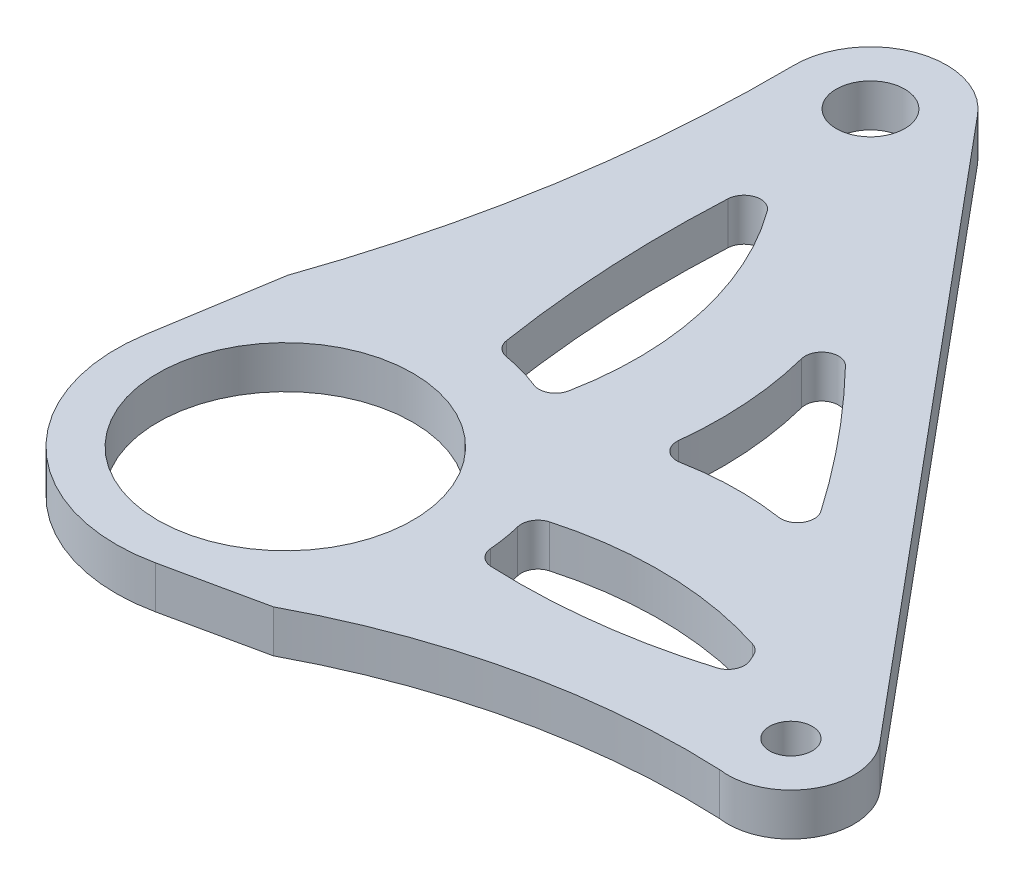
ISO-10303-21;
HEADER;
FILE_DESCRIPTION(('STEP AP214'),'2;1');
FILE_NAME('part.step','',(''),(''),'','','');
FILE_SCHEMA(('AUTOMOTIVE_DESIGN { 1 0 10303 214 1 1 1 1 }'));
ENDSEC;
DATA;
#1=APPLICATION_CONTEXT('core data for automotive mechanical design processes');
#2=APPLICATION_PROTOCOL_DEFINITION('international standard','automotive_design',2000,#1);
#3=PRODUCT_CONTEXT('',#1,'mechanical');
#4=PRODUCT('Part','Part','',(#3));
#5=PRODUCT_RELATED_PRODUCT_CATEGORY('part','',(#4));
#6=PRODUCT_DEFINITION_FORMATION('','',#4);
#7=PRODUCT_DEFINITION_CONTEXT('part definition',#1,'design');
#8=PRODUCT_DEFINITION('design','',#6,#7);
#9=PRODUCT_DEFINITION_SHAPE('','',#8);
#10=(LENGTH_UNIT() NAMED_UNIT(*) SI_UNIT(.MILLI.,.METRE.));
#11=(NAMED_UNIT(*) PLANE_ANGLE_UNIT() SI_UNIT($,.RADIAN.));
#12=(NAMED_UNIT(*) SI_UNIT($,.STERADIAN.) SOLID_ANGLE_UNIT());
#13=UNCERTAINTY_MEASURE_WITH_UNIT(LENGTH_MEASURE(1.E-05),#10,'distance_accuracy_value','');
#14=(GEOMETRIC_REPRESENTATION_CONTEXT(3) GLOBAL_UNCERTAINTY_ASSIGNED_CONTEXT((#13)) GLOBAL_UNIT_ASSIGNED_CONTEXT((#10,
#11,#12)) REPRESENTATION_CONTEXT('',''));
#15=CARTESIAN_POINT('',(0.,0.,0.));
#16=DIRECTION('',(0.,0.,1.));
#17=DIRECTION('',(1.,0.,0.));
#18=AXIS2_PLACEMENT_3D('',#15,#16,#17);
#19=CARTESIAN_POINT('',(-19.9914586600345,5.08,-3.22553571428571));
#20=DIRECTION('',(0.987232526421455,0.,0.159285714285714));
#21=DIRECTION('',(0.159285714285714,0.,-0.987232526421456));
#22=AXIS2_PLACEMENT_3D('',#19,#20,#21);
#23=PLANE('',#22);
#24=DIRECTION('',(0.,1.,0.));
#25=VECTOR('',#24,1.);
#26=CARTESIAN_POINT('',(-17.6262506561667,0.,-17.8847930346395));
#27=LINE('',#26,#25);
#28=CARTESIAN_POINT('',(-17.6262506561667,0.,-17.8847930346395));
#29=VERTEX_POINT('',#28);
#30=CARTESIAN_POINT('',(-17.6262506561667,5.08,-17.8847930346395));
#31=VERTEX_POINT('',#30);
#32=EDGE_CURVE('E246',#29,#31,#27,.T.);
#33=ORIENTED_EDGE('',*,*,#32,.F.);
#34=DIRECTION('',(-0.159285714285714,0.,0.987232526421456));
#35=VECTOR('',#34,1.);
#36=CARTESIAN_POINT('',(-19.9914586600345,0.,-3.22553571428571));
#37=LINE('',#36,#35);
#38=CARTESIAN_POINT('',(-19.9914586600345,0.,-3.22553571428571));
#39=VERTEX_POINT('',#38);
#40=EDGE_CURVE('E251',#29,#39,#37,.T.);
#41=ORIENTED_EDGE('',*,*,#40,.T.);
#42=DIRECTION('',(0.,-1.,0.));
#43=VECTOR('',#42,1.);
#44=CARTESIAN_POINT('',(-19.9914586600345,5.08,-3.22553571428571));
#45=LINE('',#44,#43);
#46=CARTESIAN_POINT('',(-19.9914586600345,5.08,-3.22553571428571));
#47=VERTEX_POINT('',#46);
#48=EDGE_CURVE('E373',#47,#39,#45,.T.);
#49=ORIENTED_EDGE('',*,*,#48,.F.);
#50=DIRECTION('',(-0.159285714285714,0.,0.987232526421456));
#51=VECTOR('',#50,1.);
#52=CARTESIAN_POINT('',(-19.9914586600345,5.08,-3.22553571428571));
#53=LINE('',#52,#51);
#54=EDGE_CURVE('E326',#31,#47,#53,.T.);
#55=ORIENTED_EDGE('',*,*,#54,.F.);
#56=EDGE_LOOP('',(#33,#41,#49,#55));
#57=FACE_BOUND('',#56,.T.);
#58=ADVANCED_FACE('F41',(#57),#23,.F.);
#59=CARTESIAN_POINT('',(4.25223214285715,5.08,19.798510595579));
#60=DIRECTION('',(-0.209986772486773,0.,-0.977704226942171));
#61=DIRECTION('',(-0.977704226942171,0.,0.209986772486773));
#62=AXIS2_PLACEMENT_3D('',#59,#60,#61);
#63=PLANE('',#62);
#64=DIRECTION('',(0.,1.,0.));
#65=VECTOR('',#64,1.);
#66=CARTESIAN_POINT('',(15.8719645912288,0.,17.3028784332586));
#67=LINE('',#66,#65);
#68=CARTESIAN_POINT('',(15.8719645912288,0.,17.3028784332586));
#69=VERTEX_POINT('',#68);
#70=CARTESIAN_POINT('',(15.8719645912288,5.08,17.3028784332586));
#71=VERTEX_POINT('',#70);
#72=EDGE_CURVE('E318',#69,#71,#67,.T.);
#73=ORIENTED_EDGE('',*,*,#72,.T.);
#74=DIRECTION('',(0.977704226942171,0.,-0.209986772486773));
#75=VECTOR('',#74,1.);
#76=CARTESIAN_POINT('',(4.25223214285715,5.08,19.798510595579));
#77=LINE('',#76,#75);
#78=CARTESIAN_POINT('',(4.25223214285714,5.08,19.798510595579));
#79=VERTEX_POINT('',#78);
#80=EDGE_CURVE('E331',#79,#71,#77,.T.);
#81=ORIENTED_EDGE('',*,*,#80,.F.);
#82=DIRECTION('',(0.,-1.,0.));
#83=VECTOR('',#82,1.);
#84=CARTESIAN_POINT('',(4.25223214285714,5.08,19.798510595579));
#85=LINE('',#84,#83);
#86=CARTESIAN_POINT('',(4.25223214285714,0.,19.798510595579));
#87=VERTEX_POINT('',#86);
#88=EDGE_CURVE('E370',#79,#87,#85,.T.);
#89=ORIENTED_EDGE('',*,*,#88,.T.);
#90=DIRECTION('',(0.977704226942171,0.,-0.209986772486773));
#91=VECTOR('',#90,1.);
#92=CARTESIAN_POINT('',(4.25223214285715,0.,19.798510595579));
#93=LINE('',#92,#91);
#94=EDGE_CURVE('E353',#87,#69,#93,.T.);
#95=ORIENTED_EDGE('',*,*,#94,.T.);
#96=EDGE_LOOP('',(#73,#81,#89,#95));
#97=FACE_BOUND('',#96,.T.);
#98=ADVANCED_FACE('F496',(#97),#63,.F.);
#99=CARTESIAN_POINT('',(0.,5.08,0.));
#100=DIRECTION('',(0.,1.,0.));
#101=DIRECTION('',(0.,0.,1.));
#102=AXIS2_PLACEMENT_3D('',#99,#100,#101);
#103=PLANE('',#102);
#104=CARTESIAN_POINT('',(-21.3828159281263,5.08,-28.968811621449));
#105=DIRECTION('',(0.,1.,0.));
#106=DIRECTION('',(0.,0.,1.));
#107=AXIS2_PLACEMENT_3D('',#104,#105,#106);
#108=CIRCLE('',#107,44.5258754149349);
#109=CARTESIAN_POINT('',(21.7591015367583,5.08,-39.9837350855225));
#110=VERTEX_POINT('',#109);
#111=CARTESIAN_POINT('',(22.8837242987162,5.08,-24.1701662072058));
#112=VERTEX_POINT('',#111);
#113=EDGE_CURVE('E282',#110,#112,#108,.F.);
#114=ORIENTED_EDGE('',*,*,#113,.F.);
#115=CARTESIAN_POINT('',(23.6969373260761,5.08,-40.4785001344485));
#116=DIRECTION('',(0.,1.,0.));
#117=DIRECTION('',(0.,0.,1.));
#118=AXIS2_PLACEMENT_3D('',#115,#116,#117);
#119=CIRCLE('',#118,2.);
#120=CARTESIAN_POINT('',(25.1313285261964,5.08,-41.8722439721094));
#121=VERTEX_POINT('',#120);
#122=EDGE_CURVE('E445',#110,#121,#119,.F.);
#123=ORIENTED_EDGE('',*,*,#122,.T.);
#124=CARTESIAN_POINT('',(-67.7138191361468,5.08,48.3418847817815));
#125=DIRECTION('',(0.,1.,0.));
#126=DIRECTION('',(0.,0.,1.));
#127=AXIS2_PLACEMENT_3D('',#124,#125,#126);
#128=CIRCLE('',#127,129.455824400704);
#129=CARTESIAN_POINT('',(38.7419162597416,5.08,-25.3194135544989));
#130=VERTEX_POINT('',#129);
#131=EDGE_CURVE('E277',#121,#130,#128,.F.);
#132=ORIENTED_EDGE('',*,*,#131,.T.);
#133=CARTESIAN_POINT('',(37.0972512029362,5.08,-24.1813991209686));
#134=DIRECTION('',(0.,1.,0.));
#135=DIRECTION('',(0.,0.,1.));
#136=AXIS2_PLACEMENT_3D('',#133,#134,#135);
#137=CIRCLE('',#136,2.);
#138=CARTESIAN_POINT('',(36.7994765641196,5.08,-22.203690784414));
#139=VERTEX_POINT('',#138);
#140=EDGE_CURVE('E441',#130,#139,#137,.F.);
#141=ORIENTED_EDGE('',*,*,#140,.T.);
#142=CARTESIAN_POINT('',(31.6532704941625,5.08,11.9754948125493));
#143=DIRECTION('',(0.,1.,0.));
#144=DIRECTION('',(0.,0.,1.));
#145=AXIS2_PLACEMENT_3D('',#142,#143,#144);
#146=CIRCLE('',#145,34.5644349727595);
#147=CARTESIAN_POINT('',(25.2429930871164,5.08,-21.9893179876244));
#148=VERTEX_POINT('',#147);
#149=EDGE_CURVE('E285',#148,#139,#146,.F.);
#150=ORIENTED_EDGE('',*,*,#149,.F.);
#151=CARTESIAN_POINT('',(24.8720755580379,5.08,-23.9546220828275));
#152=DIRECTION('',(0.,1.,0.));
#153=DIRECTION('',(0.,0.,1.));
#154=AXIS2_PLACEMENT_3D('',#151,#152,#153);
#155=CIRCLE('',#154,2.);
#156=EDGE_CURVE('E449',#148,#112,#155,.F.);
#157=ORIENTED_EDGE('',*,*,#156,.T.);
#158=EDGE_LOOP('',(#114,#123,#132,#141,#150,#157));
#159=FACE_BOUND('',#158,.T.);
#160=CARTESIAN_POINT('',(0.,5.08,-70.));
#161=DIRECTION('',(0.,1.,0.));
#162=DIRECTION('',(0.,0.,1.));
#163=AXIS2_PLACEMENT_3D('',#160,#161,#162);
#164=CIRCLE('',#163,4.10000000000001);
#165=CARTESIAN_POINT('',(0.,5.08,-65.9));
#166=VERTEX_POINT('',#165);
#167=EDGE_CURVE('E341',#166,#166,#164,.T.);
#168=ORIENTED_EDGE('',*,*,#167,.F.);
#169=EDGE_LOOP('',(#168));
#170=FACE_BOUND('',#169,.T.);
#171=CARTESIAN_POINT('',(60.48,5.08,0.));
#172=DIRECTION('',(0.,1.,0.));
#173=DIRECTION('',(0.,0.,1.));
#174=AXIS2_PLACEMENT_3D('',#171,#172,#173);
#175=CIRCLE('',#174,2.54999999999999);
#176=CARTESIAN_POINT('',(60.48,5.08,2.54999999999999));
#177=VERTEX_POINT('',#176);
#178=EDGE_CURVE('E344',#177,#177,#175,.T.);
#179=ORIENTED_EDGE('',*,*,#178,.F.);
#180=EDGE_LOOP('',(#179));
#181=FACE_BOUND('',#180,.T.);
#182=CARTESIAN_POINT('',(0.,5.08,0.));
#183=DIRECTION('',(0.,1.,0.));
#184=DIRECTION('',(0.,0.,1.));
#185=AXIS2_PLACEMENT_3D('',#182,#183,#184);
#186=CIRCLE('',#185,15.25);
#187=CARTESIAN_POINT('',(0.,5.08,15.25));
#188=VERTEX_POINT('',#187);
#189=EDGE_CURVE('E347',#188,#188,#186,.T.);
#190=ORIENTED_EDGE('',*,*,#189,.F.);
#191=EDGE_LOOP('',(#190));
#192=FACE_BOUND('',#191,.T.);
#193=CARTESIAN_POINT('',(27.9061018564134,5.08,-71.8453844913845));
#194=DIRECTION('',(0.,1.,0.));
#195=DIRECTION('',(0.,0.,1.));
#196=AXIS2_PLACEMENT_3D('',#193,#194,#195);
#197=CIRCLE('',#196,72.0203148013481);
#198=CARTESIAN_POINT('',(24.7291495693579,5.08,0.104825503104408));
#199=VERTEX_POINT('',#198);
#200=CARTESIAN_POINT('',(48.7082419065126,5.08,-2.89470129374433));
#201=VERTEX_POINT('',#200);
#202=EDGE_CURVE('E310',#199,#201,#197,.T.);
#203=ORIENTED_EDGE('',*,*,#202,.F.);
#204=CARTESIAN_POINT('',(24.8173733516565,5.08,-1.89322769044099));
#205=DIRECTION('',(0.,1.,0.));
#206=DIRECTION('',(0.,0.,1.));
#207=AXIS2_PLACEMENT_3D('',#204,#205,#206);
#208=CIRCLE('',#207,2.);
#209=CARTESIAN_POINT('',(22.8231676857903,5.08,-1.74109694986847));
#210=VERTEX_POINT('',#209);
#211=EDGE_CURVE('E425',#199,#210,#208,.F.);
#212=ORIENTED_EDGE('',*,*,#211,.T.);
#213=CARTESIAN_POINT('',(0.,5.08,0.));
#214=DIRECTION('',(0.,1.,0.));
#215=DIRECTION('',(0.,0.,1.));
#216=AXIS2_PLACEMENT_3D('',#213,#214,#215);
#217=CIRCLE('',#216,22.8894823402047);
#218=CARTESIAN_POINT('',(22.1930546313307,5.08,-5.6032783201724));
#219=VERTEX_POINT('',#218);
#220=EDGE_CURVE('E306',#210,#219,#217,.T.);
#221=ORIENTED_EDGE('',*,*,#220,.T.);
#222=CARTESIAN_POINT('',(24.132203302452,5.08,-6.09287246973781));
#223=DIRECTION('',(0.,1.,0.));
#224=DIRECTION('',(0.,0.,1.));
#225=AXIS2_PLACEMENT_3D('',#222,#223,#224);
#226=CIRCLE('',#225,2.);
#227=CARTESIAN_POINT('',(23.5944845426233,5.08,-8.01923134993856));
#228=VERTEX_POINT('',#227);
#229=EDGE_CURVE('E429',#219,#228,#226,.F.);
#230=ORIENTED_EDGE('',*,*,#229,.T.);
#231=CARTESIAN_POINT('',(35.1366815769163,5.08,33.3302907703614));
#232=DIRECTION('',(0.,1.,0.));
#233=DIRECTION('',(0.,0.,1.));
#234=AXIS2_PLACEMENT_3D('',#231,#232,#233);
#235=CIRCLE('',#234,42.9302375017378);
#236=CARTESIAN_POINT('',(48.3797465181453,5.08,-7.50629237414287));
#237=VERTEX_POINT('',#236);
#238=EDGE_CURVE('E303',#228,#237,#235,.F.);
#239=ORIENTED_EDGE('',*,*,#238,.T.);
#240=CARTESIAN_POINT('',(47.7627890675515,5.08,-5.60382988984606));
#241=DIRECTION('',(0.,1.,0.));
#242=DIRECTION('',(0.,0.,1.));
#243=AXIS2_PLACEMENT_3D('',#240,#241,#242);
#244=CIRCLE('',#243,2.);
#245=CARTESIAN_POINT('',(49.5748146653878,5.08,-6.4503304703457));
#246=VERTEX_POINT('',#245);
#247=EDGE_CURVE('E433',#237,#246,#244,.F.);
#248=ORIENTED_EDGE('',*,*,#247,.T.);
#249=CARTESIAN_POINT('',(-67.7138191361468,5.08,48.3418847817815));
#250=DIRECTION('',(0.,1.,0.));
#251=DIRECTION('',(0.,0.,1.));
#252=AXIS2_PLACEMENT_3D('',#249,#250,#251);
#253=CIRCLE('',#252,129.455824400704);
#254=CARTESIAN_POINT('',(49.9483643472405,5.08,-5.64349332366123));
#255=VERTEX_POINT('',#254);
#256=EDGE_CURVE('E295',#246,#255,#253,.F.);
#257=ORIENTED_EDGE('',*,*,#256,.T.);
#258=CARTESIAN_POINT('',(48.1305676736944,5.08,-4.80945780065005));
#259=DIRECTION('',(0.,1.,0.));
#260=DIRECTION('',(0.,0.,1.));
#261=AXIS2_PLACEMENT_3D('',#258,#259,#260);
#262=CIRCLE('',#261,2.);
#263=EDGE_CURVE('E437',#255,#201,#262,.F.);
#264=ORIENTED_EDGE('',*,*,#263,.T.);
#265=EDGE_LOOP('',(#203,#212,#221,#230,#239,#248,#257,#264));
#266=FACE_BOUND('',#265,.T.);
#267=CARTESIAN_POINT('',(136.175705560745,5.08,-45.1633915131065));
#268=DIRECTION('',(0.,1.,0.));
#269=DIRECTION('',(0.,0.,1.));
#270=AXIS2_PLACEMENT_3D('',#267,#268,#269);
#271=CIRCLE('',#270,135.566255037894);
#272=CARTESIAN_POINT('',(0.791219750413102,5.08,-52.1812620499172));
#273=VERTEX_POINT('',#272);
#274=CARTESIAN_POINT('',(2.23675248907365,5.08,-24.2214156019367));
#275=VERTEX_POINT('',#274);
#276=EDGE_CURVE('E268',#273,#275,#271,.T.);
#277=ORIENTED_EDGE('',*,*,#276,.F.);
#278=CARTESIAN_POINT('',(2.78853812101332,5.08,-52.0777278697505));
#279=DIRECTION('',(0.,1.,0.));
#280=DIRECTION('',(0.,0.,1.));
#281=AXIS2_PLACEMENT_3D('',#278,#279,#280);
#282=CIRCLE('',#281,2.);
#283=CARTESIAN_POINT('',(4.40501920666875,5.08,-53.2554327987197));
#284=VERTEX_POINT('',#283);
#285=EDGE_CURVE('E49',#273,#284,#282,.F.);
#286=ORIENTED_EDGE('',*,*,#285,.T.);
#287=CARTESIAN_POINT('',(-27.1739382834947,5.08,-30.2482388278765));
#288=DIRECTION('',(0.,1.,0.));
#289=DIRECTION('',(0.,0.,1.));
#290=AXIS2_PLACEMENT_3D('',#287,#288,#289);
#291=CIRCLE('',#290,39.0712366143887);
#292=CARTESIAN_POINT('',(11.1690669429211,5.08,-22.739878102352));
#293=VERTEX_POINT('',#292);
#294=EDGE_CURVE('E265',#284,#293,#291,.F.);
#295=ORIENTED_EDGE('',*,*,#294,.T.);
#296=CARTESIAN_POINT('',(9.20634405268656,5.08,-23.1242202105698));
#297=DIRECTION('',(0.,1.,0.));
#298=DIRECTION('',(0.,0.,1.));
#299=AXIS2_PLACEMENT_3D('',#296,#297,#298);
#300=CIRCLE('',#299,2.);
#301=CARTESIAN_POINT('',(8.46656618773552,5.08,-21.2660682494728));
#302=VERTEX_POINT('',#301);
#303=EDGE_CURVE('E453',#293,#302,#300,.F.);
#304=ORIENTED_EDGE('',*,*,#303,.T.);
#305=CARTESIAN_POINT('',(0.,5.08,0.));
#306=DIRECTION('',(0.,1.,0.));
#307=DIRECTION('',(0.,0.,1.));
#308=AXIS2_PLACEMENT_3D('',#305,#306,#307);
#309=CIRCLE('',#308,22.8894823402047);
#310=CARTESIAN_POINT('',(3.87422892966496,5.08,-22.559227646422));
#311=VERTEX_POINT('',#310);
#312=EDGE_CURVE('E261',#302,#311,#309,.T.);
#313=ORIENTED_EDGE('',*,*,#312,.T.);
#314=CARTESIAN_POINT('',(4.21274501072635,5.08,-24.5303711883445));
#315=DIRECTION('',(0.,1.,0.));
#316=DIRECTION('',(0.,0.,1.));
#317=AXIS2_PLACEMENT_3D('',#314,#315,#316);
#318=CIRCLE('',#317,2.);
#319=EDGE_CURVE('E457',#311,#275,#318,.F.);
#320=ORIENTED_EDGE('',*,*,#319,.T.);
#321=EDGE_LOOP('',(#277,#286,#295,#304,#313,#320));
#322=FACE_BOUND('',#321,.T.);
#323=CARTESIAN_POINT('',(0.,5.08,-70.));
#324=DIRECTION('',(0.,1.,0.));
#325=DIRECTION('',(0.,0.,1.));
#326=AXIS2_PLACEMENT_3D('',#323,#324,#325);
#327=CIRCLE('',#326,9.1);
#328=CARTESIAN_POINT('',(6.98456698110446,5.08,-75.8331658716743));
#329=VERTEX_POINT('',#328);
#330=CARTESIAN_POINT('',(-9.09771250547035,5.08,-69.7959726297571));
#331=VERTEX_POINT('',#330);
#332=EDGE_CURVE('E339',#329,#331,#327,.T.);
#333=ORIENTED_EDGE('',*,*,#332,.T.);
#334=CARTESIAN_POINT('',(-161.563747781534,5.08,-68.1885950458591));
#335=DIRECTION('',(0.,1.,0.));
#336=DIRECTION('',(0.,0.,1.));
#337=AXIS2_PLACEMENT_3D('',#334,#335,#336);
#338=CIRCLE('',#337,152.474507952966);
#339=EDGE_CURVE('E245',#331,#31,#338,.F.);
#340=ORIENTED_EDGE('',*,*,#339,.T.);
#341=ORIENTED_EDGE('',*,*,#54,.T.);
#342=CARTESIAN_POINT('',(0.,5.08,0.));
#343=DIRECTION('',(0.,1.,0.));
#344=DIRECTION('',(0.,0.,1.));
#345=AXIS2_PLACEMENT_3D('',#342,#343,#344);
#346=CIRCLE('',#345,20.25);
#347=EDGE_CURVE('E328',#47,#79,#346,.T.);
#348=ORIENTED_EDGE('',*,*,#347,.T.);
#349=ORIENTED_EDGE('',*,*,#80,.T.);
#350=CARTESIAN_POINT('',(55.6461354048062,5.08,92.1386812199415));
#351=DIRECTION('',(0.,1.,0.));
#352=DIRECTION('',(0.,0.,1.));
#353=AXIS2_PLACEMENT_3D('',#350,#351,#352);
#354=CIRCLE('',#353,84.7489353480911);
#355=CARTESIAN_POINT('',(59.4056899581529,5.08,7.47317589341947));
#356=VERTEX_POINT('',#355);
#357=EDGE_CURVE('E319',#71,#356,#354,.F.);
#358=ORIENTED_EDGE('',*,*,#357,.T.);
#359=CARTESIAN_POINT('',(60.48,5.08,0.));
#360=DIRECTION('',(0.,1.,0.));
#361=DIRECTION('',(0.,0.,1.));
#362=AXIS2_PLACEMENT_3D('',#359,#360,#361);
#363=CIRCLE('',#362,7.54999999999996);
#364=CARTESIAN_POINT('',(66.2748879898174,5.08,-4.83960465177369));
#365=VERTEX_POINT('',#364);
#366=EDGE_CURVE('E334',#356,#365,#363,.T.);
#367=ORIENTED_EDGE('',*,*,#366,.T.);
#368=DIRECTION('',(0.641007238645523,0.,0.767534833088403));
#369=VECTOR('',#368,1.);
#370=CARTESIAN_POINT('',(41.4242438556619,5.08,-34.5954854713913));
#371=LINE('',#370,#369);
#372=EDGE_CURVE('E336',#329,#365,#371,.T.);
#373=ORIENTED_EDGE('',*,*,#372,.F.);
#374=EDGE_LOOP('',(#333,#340,#341,#348,#349,#358,#367,#373));
#375=FACE_BOUND('',#374,.T.);
#376=ADVANCED_FACE('F463',(#159,#170,#181,#192,#266,#322,#375),#103,.T.);
#377=CARTESIAN_POINT('',(0.,0.,0.));
#378=DIRECTION('',(0.,1.,0.));
#379=DIRECTION('',(0.,0.,1.));
#380=AXIS2_PLACEMENT_3D('',#377,#378,#379);
#381=PLANE('',#380);
#382=CARTESIAN_POINT('',(-27.1739382834947,0.,-30.2482388278765));
#383=DIRECTION('',(0.,1.,0.));
#384=DIRECTION('',(0.,0.,1.));
#385=AXIS2_PLACEMENT_3D('',#382,#383,#384);
#386=CIRCLE('',#385,39.0712366143887);
#387=CARTESIAN_POINT('',(4.40501920666875,0.,-53.2554327987197));
#388=VERTEX_POINT('',#387);
#389=CARTESIAN_POINT('',(11.1690669429211,0.,-22.739878102352));
#390=VERTEX_POINT('',#389);
#391=EDGE_CURVE('E257',#388,#390,#386,.F.);
#392=ORIENTED_EDGE('',*,*,#391,.F.);
#393=CARTESIAN_POINT('',(2.78853812101332,0.,-52.0777278697505));
#394=DIRECTION('',(0.,1.,0.));
#395=DIRECTION('',(0.,0.,1.));
#396=AXIS2_PLACEMENT_3D('',#393,#394,#395);
#397=CIRCLE('',#396,2.);
#398=CARTESIAN_POINT('',(0.791219750413102,0.,-52.1812620499172));
#399=VERTEX_POINT('',#398);
#400=EDGE_CURVE('E11',#388,#399,#397,.T.);
#401=ORIENTED_EDGE('',*,*,#400,.T.);
#402=CARTESIAN_POINT('',(136.175705560745,0.,-45.1633915131065));
#403=DIRECTION('',(0.,1.,0.));
#404=DIRECTION('',(0.,0.,1.));
#405=AXIS2_PLACEMENT_3D('',#402,#403,#404);
#406=CIRCLE('',#405,135.566255037894);
#407=CARTESIAN_POINT('',(2.23675248907365,0.,-24.2214156019367));
#408=VERTEX_POINT('',#407);
#409=EDGE_CURVE('E260',#399,#408,#406,.T.);
#410=ORIENTED_EDGE('',*,*,#409,.T.);
#411=CARTESIAN_POINT('',(4.21274501072635,0.,-24.5303711883445));
#412=DIRECTION('',(0.,1.,0.));
#413=DIRECTION('',(0.,0.,1.));
#414=AXIS2_PLACEMENT_3D('',#411,#412,#413);
#415=CIRCLE('',#414,2.);
#416=CARTESIAN_POINT('',(3.87422892966496,0.,-22.559227646422));
#417=VERTEX_POINT('',#416);
#418=EDGE_CURVE('E459',#408,#417,#415,.T.);
#419=ORIENTED_EDGE('',*,*,#418,.T.);
#420=CARTESIAN_POINT('',(0.,0.,0.));
#421=DIRECTION('',(0.,1.,0.));
#422=DIRECTION('',(0.,0.,1.));
#423=AXIS2_PLACEMENT_3D('',#420,#421,#422);
#424=CIRCLE('',#423,22.8894823402047);
#425=CARTESIAN_POINT('',(8.46656618773552,0.,-21.2660682494728));
#426=VERTEX_POINT('',#425);
#427=EDGE_CURVE('E253',#426,#417,#424,.T.);
#428=ORIENTED_EDGE('',*,*,#427,.F.);
#429=CARTESIAN_POINT('',(9.20634405268656,0.,-23.1242202105698));
#430=DIRECTION('',(0.,1.,0.));
#431=DIRECTION('',(0.,0.,1.));
#432=AXIS2_PLACEMENT_3D('',#429,#430,#431);
#433=CIRCLE('',#432,2.);
#434=EDGE_CURVE('E455',#426,#390,#433,.T.);
#435=ORIENTED_EDGE('',*,*,#434,.T.);
#436=EDGE_LOOP('',(#392,#401,#410,#419,#428,#435));
#437=FACE_BOUND('',#436,.T.);
#438=CARTESIAN_POINT('',(-67.7138191361468,0.,48.3418847817815));
#439=DIRECTION('',(0.,1.,0.));
#440=DIRECTION('',(0.,0.,1.));
#441=AXIS2_PLACEMENT_3D('',#438,#439,#440);
#442=CIRCLE('',#441,129.455824400704);
#443=CARTESIAN_POINT('',(25.1313285261964,0.,-41.8722439721094));
#444=VERTEX_POINT('',#443);
#445=CARTESIAN_POINT('',(38.7419162597416,0.,-25.3194135544989));
#446=VERTEX_POINT('',#445);
#447=EDGE_CURVE('E269',#444,#446,#442,.F.);
#448=ORIENTED_EDGE('',*,*,#447,.F.);
#449=CARTESIAN_POINT('',(23.6969373260761,0.,-40.4785001344485));
#450=DIRECTION('',(0.,1.,0.));
#451=DIRECTION('',(0.,0.,1.));
#452=AXIS2_PLACEMENT_3D('',#449,#450,#451);
#453=CIRCLE('',#452,2.);
#454=CARTESIAN_POINT('',(21.7591015367583,0.,-39.9837350855225));
#455=VERTEX_POINT('',#454);
#456=EDGE_CURVE('E447',#444,#455,#453,.T.);
#457=ORIENTED_EDGE('',*,*,#456,.T.);
#458=CARTESIAN_POINT('',(-21.3828159281263,0.,-28.968811621449));
#459=DIRECTION('',(0.,1.,0.));
#460=DIRECTION('',(0.,0.,1.));
#461=AXIS2_PLACEMENT_3D('',#458,#459,#460);
#462=CIRCLE('',#461,44.5258754149349);
#463=CARTESIAN_POINT('',(22.8837242987162,0.,-24.1701662072058));
#464=VERTEX_POINT('',#463);
#465=EDGE_CURVE('E273',#455,#464,#462,.F.);
#466=ORIENTED_EDGE('',*,*,#465,.T.);
#467=CARTESIAN_POINT('',(24.8720755580379,0.,-23.9546220828275));
#468=DIRECTION('',(0.,1.,0.));
#469=DIRECTION('',(0.,0.,1.));
#470=AXIS2_PLACEMENT_3D('',#467,#468,#469);
#471=CIRCLE('',#470,2.);
#472=CARTESIAN_POINT('',(25.2429930871164,0.,-21.9893179876244));
#473=VERTEX_POINT('',#472);
#474=EDGE_CURVE('E451',#464,#473,#471,.T.);
#475=ORIENTED_EDGE('',*,*,#474,.T.);
#476=CARTESIAN_POINT('',(31.6532704941625,0.,11.9754948125493));
#477=DIRECTION('',(0.,1.,0.));
#478=DIRECTION('',(0.,0.,1.));
#479=AXIS2_PLACEMENT_3D('',#476,#477,#478);
#480=CIRCLE('',#479,34.5644349727595);
#481=CARTESIAN_POINT('',(36.7994765641196,0.,-22.203690784414));
#482=VERTEX_POINT('',#481);
#483=EDGE_CURVE('E276',#473,#482,#480,.F.);
#484=ORIENTED_EDGE('',*,*,#483,.T.);
#485=CARTESIAN_POINT('',(37.0972512029362,0.,-24.1813991209686));
#486=DIRECTION('',(0.,1.,0.));
#487=DIRECTION('',(0.,0.,1.));
#488=AXIS2_PLACEMENT_3D('',#485,#486,#487);
#489=CIRCLE('',#488,2.);
#490=EDGE_CURVE('E443',#482,#446,#489,.T.);
#491=ORIENTED_EDGE('',*,*,#490,.T.);
#492=EDGE_LOOP('',(#448,#457,#466,#475,#484,#491));
#493=FACE_BOUND('',#492,.T.);
#494=CARTESIAN_POINT('',(0.,0.,-70.));
#495=DIRECTION('',(0.,1.,0.));
#496=DIRECTION('',(0.,0.,1.));
#497=AXIS2_PLACEMENT_3D('',#494,#495,#496);
#498=CIRCLE('',#497,4.10000000000001);
#499=CARTESIAN_POINT('',(0.,0.,-65.9));
#500=VERTEX_POINT('',#499);
#501=EDGE_CURVE('E237',#500,#500,#498,.T.);
#502=ORIENTED_EDGE('',*,*,#501,.T.);
#503=EDGE_LOOP('',(#502));
#504=FACE_BOUND('',#503,.T.);
#505=CARTESIAN_POINT('',(60.48,0.,0.));
#506=DIRECTION('',(0.,1.,0.));
#507=DIRECTION('',(0.,0.,1.));
#508=AXIS2_PLACEMENT_3D('',#505,#506,#507);
#509=CIRCLE('',#508,2.54999999999999);
#510=CARTESIAN_POINT('',(60.48,0.,2.54999999999999));
#511=VERTEX_POINT('',#510);
#512=EDGE_CURVE('E362',#511,#511,#509,.T.);
#513=ORIENTED_EDGE('',*,*,#512,.T.);
#514=EDGE_LOOP('',(#513));
#515=FACE_BOUND('',#514,.T.);
#516=CARTESIAN_POINT('',(0.,0.,0.));
#517=DIRECTION('',(0.,1.,0.));
#518=DIRECTION('',(0.,0.,1.));
#519=AXIS2_PLACEMENT_3D('',#516,#517,#518);
#520=CIRCLE('',#519,15.25);
#521=CARTESIAN_POINT('',(0.,0.,15.25));
#522=VERTEX_POINT('',#521);
#523=EDGE_CURVE('E329',#522,#522,#520,.T.);
#524=ORIENTED_EDGE('',*,*,#523,.T.);
#525=EDGE_LOOP('',(#524));
#526=FACE_BOUND('',#525,.T.);
#527=CARTESIAN_POINT('',(35.1366815769163,0.,33.3302907703614));
#528=DIRECTION('',(0.,1.,0.));
#529=DIRECTION('',(0.,0.,1.));
#530=AXIS2_PLACEMENT_3D('',#527,#528,#529);
#531=CIRCLE('',#530,42.9302375017378);
#532=CARTESIAN_POINT('',(23.5944845426233,0.,-8.01923134993856));
#533=VERTEX_POINT('',#532);
#534=CARTESIAN_POINT('',(48.3797465181453,0.,-7.50629237414287));
#535=VERTEX_POINT('',#534);
#536=EDGE_CURVE('E291',#533,#535,#531,.F.);
#537=ORIENTED_EDGE('',*,*,#536,.F.);
#538=CARTESIAN_POINT('',(24.132203302452,0.,-6.09287246973781));
#539=DIRECTION('',(0.,1.,0.));
#540=DIRECTION('',(0.,0.,1.));
#541=AXIS2_PLACEMENT_3D('',#538,#539,#540);
#542=CIRCLE('',#541,2.);
#543=CARTESIAN_POINT('',(22.1930546313307,0.,-5.6032783201724));
#544=VERTEX_POINT('',#543);
#545=EDGE_CURVE('E431',#533,#544,#542,.T.);
#546=ORIENTED_EDGE('',*,*,#545,.T.);
#547=CARTESIAN_POINT('',(0.,0.,0.));
#548=DIRECTION('',(0.,1.,0.));
#549=DIRECTION('',(0.,0.,1.));
#550=AXIS2_PLACEMENT_3D('',#547,#548,#549);
#551=CIRCLE('',#550,22.8894823402047);
#552=CARTESIAN_POINT('',(22.8231676857903,0.,-1.74109694986847));
#553=VERTEX_POINT('',#552);
#554=EDGE_CURVE('E294',#553,#544,#551,.T.);
#555=ORIENTED_EDGE('',*,*,#554,.F.);
#556=CARTESIAN_POINT('',(24.8173733516565,0.,-1.89322769044099));
#557=DIRECTION('',(0.,1.,0.));
#558=DIRECTION('',(0.,0.,1.));
#559=AXIS2_PLACEMENT_3D('',#556,#557,#558);
#560=CIRCLE('',#559,2.);
#561=CARTESIAN_POINT('',(24.7291495693579,0.,0.104825503104408));
#562=VERTEX_POINT('',#561);
#563=EDGE_CURVE('E427',#553,#562,#560,.T.);
#564=ORIENTED_EDGE('',*,*,#563,.T.);
#565=CARTESIAN_POINT('',(27.9061018564134,0.,-71.8453844913845));
#566=DIRECTION('',(0.,1.,0.));
#567=DIRECTION('',(0.,0.,1.));
#568=AXIS2_PLACEMENT_3D('',#565,#566,#567);
#569=CIRCLE('',#568,72.0203148013481);
#570=CARTESIAN_POINT('',(48.7082419065126,0.,-2.89470129374433));
#571=VERTEX_POINT('',#570);
#572=EDGE_CURVE('E298',#562,#571,#569,.T.);
#573=ORIENTED_EDGE('',*,*,#572,.T.);
#574=CARTESIAN_POINT('',(48.1305676736944,0.,-4.80945780065005));
#575=DIRECTION('',(0.,1.,0.));
#576=DIRECTION('',(0.,0.,1.));
#577=AXIS2_PLACEMENT_3D('',#574,#575,#576);
#578=CIRCLE('',#577,2.);
#579=CARTESIAN_POINT('',(49.9483643472405,0.,-5.64349332366123));
#580=VERTEX_POINT('',#579);
#581=EDGE_CURVE('E439',#571,#580,#578,.T.);
#582=ORIENTED_EDGE('',*,*,#581,.T.);
#583=CARTESIAN_POINT('',(-67.7138191361468,0.,48.3418847817815));
#584=DIRECTION('',(0.,1.,0.));
#585=DIRECTION('',(0.,0.,1.));
#586=AXIS2_PLACEMENT_3D('',#583,#584,#585);
#587=CIRCLE('',#586,129.455824400704);
#588=CARTESIAN_POINT('',(49.5748146653878,0.,-6.4503304703457));
#589=VERTEX_POINT('',#588);
#590=EDGE_CURVE('E286',#589,#580,#587,.F.);
#591=ORIENTED_EDGE('',*,*,#590,.F.);
#592=CARTESIAN_POINT('',(47.7627890675515,0.,-5.60382988984606));
#593=DIRECTION('',(0.,1.,0.));
#594=DIRECTION('',(0.,0.,1.));
#595=AXIS2_PLACEMENT_3D('',#592,#593,#594);
#596=CIRCLE('',#595,2.);
#597=EDGE_CURVE('E435',#589,#535,#596,.T.);
#598=ORIENTED_EDGE('',*,*,#597,.T.);
#599=EDGE_LOOP('',(#537,#546,#555,#564,#573,#582,#591,#598));
#600=FACE_BOUND('',#599,.T.);
#601=CARTESIAN_POINT('',(-161.563747781534,0.,-68.1885950458591));
#602=DIRECTION('',(0.,1.,0.));
#603=DIRECTION('',(0.,0.,1.));
#604=AXIS2_PLACEMENT_3D('',#601,#602,#603);
#605=CIRCLE('',#604,152.474507952966);
#606=CARTESIAN_POINT('',(-9.09771250547035,0.,-69.7959726297571));
#607=VERTEX_POINT('',#606);
#608=EDGE_CURVE('E242',#607,#29,#605,.F.);
#609=ORIENTED_EDGE('',*,*,#608,.F.);
#610=CARTESIAN_POINT('',(0.,0.,-70.));
#611=DIRECTION('',(0.,1.,0.));
#612=DIRECTION('',(0.,0.,1.));
#613=AXIS2_PLACEMENT_3D('',#610,#611,#612);
#614=CIRCLE('',#613,9.1);
#615=CARTESIAN_POINT('',(6.98456698110446,0.,-75.8331658716743));
#616=VERTEX_POINT('',#615);
#617=EDGE_CURVE('E226',#616,#607,#614,.T.);
#618=ORIENTED_EDGE('',*,*,#617,.F.);
#619=DIRECTION('',(0.641007238645523,0.,0.767534833088403));
#620=VECTOR('',#619,1.);
#621=CARTESIAN_POINT('',(41.4242438556619,0.,-34.5954854713913));
#622=LINE('',#621,#620);
#623=CARTESIAN_POINT('',(66.2748879898174,0.,-4.83960465177369));
#624=VERTEX_POINT('',#623);
#625=EDGE_CURVE('E238',#616,#624,#622,.T.);
#626=ORIENTED_EDGE('',*,*,#625,.T.);
#627=CARTESIAN_POINT('',(60.48,0.,0.));
#628=DIRECTION('',(0.,1.,0.));
#629=DIRECTION('',(0.,0.,1.));
#630=AXIS2_PLACEMENT_3D('',#627,#628,#629);
#631=CIRCLE('',#630,7.54999999999996);
#632=CARTESIAN_POINT('',(59.4056899581529,0.,7.47317589341947));
#633=VERTEX_POINT('',#632);
#634=EDGE_CURVE('E356',#633,#624,#631,.T.);
#635=ORIENTED_EDGE('',*,*,#634,.F.);
#636=CARTESIAN_POINT('',(55.6461354048062,0.,92.1386812199415));
#637=DIRECTION('',(0.,1.,0.));
#638=DIRECTION('',(0.,0.,1.));
#639=AXIS2_PLACEMENT_3D('',#636,#637,#638);
#640=CIRCLE('',#639,84.7489353480911);
#641=EDGE_CURVE('E315',#69,#633,#640,.F.);
#642=ORIENTED_EDGE('',*,*,#641,.F.);
#643=ORIENTED_EDGE('',*,*,#94,.F.);
#644=CARTESIAN_POINT('',(0.,0.,0.));
#645=DIRECTION('',(0.,1.,0.));
#646=DIRECTION('',(0.,0.,1.));
#647=AXIS2_PLACEMENT_3D('',#644,#645,#646);
#648=CIRCLE('',#647,20.25);
#649=EDGE_CURVE('E351',#39,#87,#648,.T.);
#650=ORIENTED_EDGE('',*,*,#649,.F.);
#651=ORIENTED_EDGE('',*,*,#40,.F.);
#652=EDGE_LOOP('',(#609,#618,#626,#635,#642,#643,#650,#651));
#653=FACE_BOUND('',#652,.T.);
#654=ADVANCED_FACE('F249',(#437,#493,#504,#515,#526,#600,#653),#381,.F.);
#655=CARTESIAN_POINT('',(0.,5.08,0.));
#656=DIRECTION('',(0.,-1.,0.));
#657=DIRECTION('',(0.,0.,-1.));
#658=AXIS2_PLACEMENT_3D('',#655,#656,#657);
#659=CYLINDRICAL_SURFACE('',#658,20.25);
#660=ORIENTED_EDGE('',*,*,#649,.T.);
#661=ORIENTED_EDGE('',*,*,#88,.F.);
#662=ORIENTED_EDGE('',*,*,#347,.F.);
#663=ORIENTED_EDGE('',*,*,#48,.T.);
#664=EDGE_LOOP('',(#660,#661,#662,#663));
#665=FACE_BOUND('',#664,.T.);
#666=ADVANCED_FACE('F506',(#665),#659,.T.);
#667=CARTESIAN_POINT('',(60.48,5.08,0.));
#668=DIRECTION('',(0.,-1.,0.));
#669=DIRECTION('',(0.,0.,-1.));
#670=AXIS2_PLACEMENT_3D('',#667,#668,#669);
#671=CYLINDRICAL_SURFACE('',#670,7.54999999999996);
#672=ORIENTED_EDGE('',*,*,#634,.T.);
#673=DIRECTION('',(0.,-1.,0.));
#674=VECTOR('',#673,1.);
#675=CARTESIAN_POINT('',(66.2748879898174,5.08,-4.83960465177369));
#676=LINE('',#675,#674);
#677=EDGE_CURVE('E368',#365,#624,#676,.T.);
#678=ORIENTED_EDGE('',*,*,#677,.F.);
#679=ORIENTED_EDGE('',*,*,#366,.F.);
#680=DIRECTION('',(0.,1.,0.));
#681=VECTOR('',#680,1.);
#682=CARTESIAN_POINT('',(59.4056899581529,0.,7.47317589341947));
#683=LINE('',#682,#681);
#684=EDGE_CURVE('E307',#633,#356,#683,.T.);
#685=ORIENTED_EDGE('',*,*,#684,.F.);
#686=EDGE_LOOP('',(#672,#678,#679,#685));
#687=FACE_BOUND('',#686,.T.);
#688=ADVANCED_FACE('F627',(#687),#671,.T.);
#689=CARTESIAN_POINT('',(41.4242438556619,5.08,-34.5954854713913));
#690=DIRECTION('',(0.767534833088403,0.,-0.641007238645523));
#691=DIRECTION('',(-0.641007238645523,0.,-0.767534833088403));
#692=AXIS2_PLACEMENT_3D('',#689,#690,#691);
#693=PLANE('',#692);
#694=ORIENTED_EDGE('',*,*,#625,.F.);
#695=DIRECTION('',(0.,-1.,0.));
#696=VECTOR('',#695,1.);
#697=CARTESIAN_POINT('',(6.98456698110446,5.08,-75.8331658716743));
#698=LINE('',#697,#696);
#699=EDGE_CURVE('E232',#329,#616,#698,.T.);
#700=ORIENTED_EDGE('',*,*,#699,.F.);
#701=ORIENTED_EDGE('',*,*,#372,.T.);
#702=ORIENTED_EDGE('',*,*,#677,.T.);
#703=EDGE_LOOP('',(#694,#700,#701,#702));
#704=FACE_BOUND('',#703,.T.);
#705=ADVANCED_FACE('F618',(#704),#693,.T.);
#706=CARTESIAN_POINT('',(60.48,5.08,0.));
#707=DIRECTION('',(0.,-1.,0.));
#708=DIRECTION('',(0.,0.,-1.));
#709=AXIS2_PLACEMENT_3D('',#706,#707,#708);
#710=CYLINDRICAL_SURFACE('',#709,2.54999999999999);
#711=ORIENTED_EDGE('',*,*,#178,.T.);
#712=EDGE_LOOP('',(#711));
#713=FACE_BOUND('',#712,.T.);
#714=ORIENTED_EDGE('',*,*,#512,.F.);
#715=EDGE_LOOP('',(#714));
#716=FACE_BOUND('',#715,.T.);
#717=ADVANCED_FACE('F614',(#713,#716),#710,.F.);
#718=CARTESIAN_POINT('',(0.,5.08,-70.));
#719=DIRECTION('',(0.,-1.,0.));
#720=DIRECTION('',(0.,0.,-1.));
#721=AXIS2_PLACEMENT_3D('',#718,#719,#720);
#722=CYLINDRICAL_SURFACE('',#721,4.10000000000001);
#723=ORIENTED_EDGE('',*,*,#167,.T.);
#724=EDGE_LOOP('',(#723));
#725=FACE_BOUND('',#724,.T.);
#726=ORIENTED_EDGE('',*,*,#501,.F.);
#727=EDGE_LOOP('',(#726));
#728=FACE_BOUND('',#727,.T.);
#729=ADVANCED_FACE('F617',(#725,#728),#722,.F.);
#730=CARTESIAN_POINT('',(0.,5.08,-70.));
#731=DIRECTION('',(0.,-1.,0.));
#732=DIRECTION('',(0.,0.,-1.));
#733=AXIS2_PLACEMENT_3D('',#730,#731,#732);
#734=CYLINDRICAL_SURFACE('',#733,9.1);
#735=ORIENTED_EDGE('',*,*,#617,.T.);
#736=DIRECTION('',(0.,1.,0.));
#737=VECTOR('',#736,1.);
#738=CARTESIAN_POINT('',(-9.09771250547035,0.,-69.7959726297571));
#739=LINE('',#738,#737);
#740=EDGE_CURVE('E230',#607,#331,#739,.T.);
#741=ORIENTED_EDGE('',*,*,#740,.T.);
#742=ORIENTED_EDGE('',*,*,#332,.F.);
#743=ORIENTED_EDGE('',*,*,#699,.T.);
#744=EDGE_LOOP('',(#735,#741,#742,#743));
#745=FACE_BOUND('',#744,.T.);
#746=ADVANCED_FACE('F228',(#745),#734,.T.);
#747=CARTESIAN_POINT('',(0.,5.08,0.));
#748=DIRECTION('',(0.,-1.,0.));
#749=DIRECTION('',(0.,0.,-1.));
#750=AXIS2_PLACEMENT_3D('',#747,#748,#749);
#751=CYLINDRICAL_SURFACE('',#750,15.25);
#752=ORIENTED_EDGE('',*,*,#189,.T.);
#753=EDGE_LOOP('',(#752));
#754=FACE_BOUND('',#753,.T.);
#755=ORIENTED_EDGE('',*,*,#523,.F.);
#756=EDGE_LOOP('',(#755));
#757=FACE_BOUND('',#756,.T.);
#758=ADVANCED_FACE('F606',(#754,#757),#751,.F.);
#759=CARTESIAN_POINT('',(55.6461354048062,0.,92.1386812199415));
#760=DIRECTION('',(0.,1.,0.));
#761=DIRECTION('',(0.,0.,1.));
#762=AXIS2_PLACEMENT_3D('',#759,#760,#761);
#763=CYLINDRICAL_SURFACE('',#762,84.7489353480911);
#764=ORIENTED_EDGE('',*,*,#357,.F.);
#765=ORIENTED_EDGE('',*,*,#72,.F.);
#766=ORIENTED_EDGE('',*,*,#641,.T.);
#767=ORIENTED_EDGE('',*,*,#684,.T.);
#768=EDGE_LOOP('',(#764,#765,#766,#767));
#769=FACE_BOUND('',#768,.T.);
#770=ADVANCED_FACE('F604',(#769),#763,.F.);
#771=CARTESIAN_POINT('',(35.1366815769163,0.,33.3302907703614));
#772=DIRECTION('',(0.,1.,0.));
#773=DIRECTION('',(0.,0.,1.));
#774=AXIS2_PLACEMENT_3D('',#771,#772,#773);
#775=CYLINDRICAL_SURFACE('',#774,42.9302375017378);
#776=ORIENTED_EDGE('',*,*,#238,.F.);
#777=DIRECTION('',(0.,1.,0.));
#778=VECTOR('',#777,1.);
#779=CARTESIAN_POINT('',(23.5944845426233,0.,-8.01923134993857));
#780=LINE('',#779,#778);
#781=EDGE_CURVE('E389',#228,#533,#780,.F.);
#782=ORIENTED_EDGE('',*,*,#781,.T.);
#783=ORIENTED_EDGE('',*,*,#536,.T.);
#784=DIRECTION('',(0.,1.,0.));
#785=VECTOR('',#784,1.);
#786=CARTESIAN_POINT('',(48.3797465181453,0.,-7.50629237414288));
#787=LINE('',#786,#785);
#788=EDGE_CURVE('E386',#535,#237,#787,.T.);
#789=ORIENTED_EDGE('',*,*,#788,.T.);
#790=EDGE_LOOP('',(#776,#782,#783,#789));
#791=FACE_BOUND('',#790,.T.);
#792=ADVANCED_FACE('F584',(#791),#775,.F.);
#793=CARTESIAN_POINT('',(-67.7138191361468,0.,48.3418847817815));
#794=DIRECTION('',(0.,1.,0.));
#795=DIRECTION('',(0.,0.,1.));
#796=AXIS2_PLACEMENT_3D('',#793,#794,#795);
#797=CYLINDRICAL_SURFACE('',#796,129.455824400704);
#798=ORIENTED_EDGE('',*,*,#256,.F.);
#799=DIRECTION('',(0.,1.,0.));
#800=VECTOR('',#799,1.);
#801=CARTESIAN_POINT('',(49.5748146653878,0.,-6.4503304703457));
#802=LINE('',#801,#800);
#803=EDGE_CURVE('E394',#246,#589,#802,.F.);
#804=ORIENTED_EDGE('',*,*,#803,.T.);
#805=ORIENTED_EDGE('',*,*,#590,.T.);
#806=DIRECTION('',(0.,1.,0.));
#807=VECTOR('',#806,1.);
#808=CARTESIAN_POINT('',(49.9483643472405,0.,-5.64349332366123));
#809=LINE('',#808,#807);
#810=EDGE_CURVE('E391',#580,#255,#809,.T.);
#811=ORIENTED_EDGE('',*,*,#810,.T.);
#812=EDGE_LOOP('',(#798,#804,#805,#811));
#813=FACE_BOUND('',#812,.T.);
#814=ADVANCED_FACE('F578',(#813),#797,.F.);
#815=CARTESIAN_POINT('',(27.9061018564134,0.,-71.8453844913845));
#816=DIRECTION('',(0.,1.,0.));
#817=DIRECTION('',(0.,0.,1.));
#818=AXIS2_PLACEMENT_3D('',#815,#816,#817);
#819=CYLINDRICAL_SURFACE('',#818,72.0203148013481);
#820=ORIENTED_EDGE('',*,*,#572,.F.);
#821=DIRECTION('',(0.,1.,0.));
#822=VECTOR('',#821,1.);
#823=CARTESIAN_POINT('',(24.7291495693579,0.,0.104825503104408));
#824=LINE('',#823,#822);
#825=EDGE_CURVE('E378',#562,#199,#824,.T.);
#826=ORIENTED_EDGE('',*,*,#825,.T.);
#827=ORIENTED_EDGE('',*,*,#202,.T.);
#828=DIRECTION('',(0.,1.,0.));
#829=VECTOR('',#828,1.);
#830=CARTESIAN_POINT('',(48.7082419065126,0.,-2.89470129374433));
#831=LINE('',#830,#829);
#832=EDGE_CURVE('E376',#201,#571,#831,.F.);
#833=ORIENTED_EDGE('',*,*,#832,.T.);
#834=EDGE_LOOP('',(#820,#826,#827,#833));
#835=FACE_BOUND('',#834,.T.);
#836=ADVANCED_FACE('F568',(#835),#819,.F.);
#837=CARTESIAN_POINT('',(0.,0.,0.));
#838=DIRECTION('',(0.,1.,0.));
#839=DIRECTION('',(0.,0.,1.));
#840=AXIS2_PLACEMENT_3D('',#837,#838,#839);
#841=CYLINDRICAL_SURFACE('',#840,22.8894823402047);
#842=ORIENTED_EDGE('',*,*,#220,.F.);
#843=DIRECTION('',(0.,1.,0.));
#844=VECTOR('',#843,1.);
#845=CARTESIAN_POINT('',(22.8231676857903,0.,-1.74109694986847));
#846=LINE('',#845,#844);
#847=EDGE_CURVE('E384',#210,#553,#846,.F.);
#848=ORIENTED_EDGE('',*,*,#847,.T.);
#849=ORIENTED_EDGE('',*,*,#554,.T.);
#850=DIRECTION('',(0.,1.,0.));
#851=VECTOR('',#850,1.);
#852=CARTESIAN_POINT('',(22.1930546313307,0.,-5.6032783201724));
#853=LINE('',#852,#851);
#854=EDGE_CURVE('E381',#544,#219,#853,.T.);
#855=ORIENTED_EDGE('',*,*,#854,.T.);
#856=EDGE_LOOP('',(#842,#848,#849,#855));
#857=FACE_BOUND('',#856,.T.);
#858=ADVANCED_FACE('F590',(#857),#841,.T.);
#859=CARTESIAN_POINT('',(-21.3828159281263,0.,-28.968811621449));
#860=DIRECTION('',(0.,1.,0.));
#861=DIRECTION('',(0.,0.,1.));
#862=AXIS2_PLACEMENT_3D('',#859,#860,#861);
#863=CYLINDRICAL_SURFACE('',#862,44.5258754149349);
#864=ORIENTED_EDGE('',*,*,#465,.F.);
#865=DIRECTION('',(0.,1.,0.));
#866=VECTOR('',#865,1.);
#867=CARTESIAN_POINT('',(21.7591015367583,0.,-39.9837350855225));
#868=LINE('',#867,#866);
#869=EDGE_CURVE('E408',#455,#110,#868,.T.);
#870=ORIENTED_EDGE('',*,*,#869,.T.);
#871=ORIENTED_EDGE('',*,*,#113,.T.);
#872=DIRECTION('',(0.,1.,0.));
#873=VECTOR('',#872,1.);
#874=CARTESIAN_POINT('',(22.8837242987162,0.,-24.1701662072058));
#875=LINE('',#874,#873);
#876=EDGE_CURVE('E406',#112,#464,#875,.F.);
#877=ORIENTED_EDGE('',*,*,#876,.T.);
#878=EDGE_LOOP('',(#864,#870,#871,#877));
#879=FACE_BOUND('',#878,.T.);
#880=ADVANCED_FACE('F539',(#879),#863,.T.);
#881=CARTESIAN_POINT('',(-67.7138191361468,0.,48.3418847817815));
#882=DIRECTION('',(0.,1.,0.));
#883=DIRECTION('',(0.,0.,1.));
#884=AXIS2_PLACEMENT_3D('',#881,#882,#883);
#885=CYLINDRICAL_SURFACE('',#884,129.455824400704);
#886=ORIENTED_EDGE('',*,*,#447,.T.);
#887=DIRECTION('',(0.,1.,0.));
#888=VECTOR('',#887,1.);
#889=CARTESIAN_POINT('',(38.7419162597416,0.,-25.3194135544989));
#890=LINE('',#889,#888);
#891=EDGE_CURVE('E398',#446,#130,#890,.T.);
#892=ORIENTED_EDGE('',*,*,#891,.T.);
#893=ORIENTED_EDGE('',*,*,#131,.F.);
#894=DIRECTION('',(0.,1.,0.));
#895=VECTOR('',#894,1.);
#896=CARTESIAN_POINT('',(25.1313285261964,0.,-41.8722439721094));
#897=LINE('',#896,#895);
#898=EDGE_CURVE('E396',#121,#444,#897,.F.);
#899=ORIENTED_EDGE('',*,*,#898,.T.);
#900=EDGE_LOOP('',(#886,#892,#893,#899));
#901=FACE_BOUND('',#900,.T.);
#902=ADVANCED_FACE('F551',(#901),#885,.F.);
#903=CARTESIAN_POINT('',(31.6532704941625,0.,11.9754948125493));
#904=DIRECTION('',(0.,1.,0.));
#905=DIRECTION('',(0.,0.,1.));
#906=AXIS2_PLACEMENT_3D('',#903,#904,#905);
#907=CYLINDRICAL_SURFACE('',#906,34.5644349727595);
#908=ORIENTED_EDGE('',*,*,#149,.T.);
#909=DIRECTION('',(0.,1.,0.));
#910=VECTOR('',#909,1.);
#911=CARTESIAN_POINT('',(36.7994765641196,0.,-22.203690784414));
#912=LINE('',#911,#910);
#913=EDGE_CURVE('E404',#139,#482,#912,.F.);
#914=ORIENTED_EDGE('',*,*,#913,.T.);
#915=ORIENTED_EDGE('',*,*,#483,.F.);
#916=DIRECTION('',(0.,1.,0.));
#917=VECTOR('',#916,1.);
#918=CARTESIAN_POINT('',(25.2429930871164,0.,-21.9893179876244));
#919=LINE('',#918,#917);
#920=EDGE_CURVE('E401',#473,#148,#919,.T.);
#921=ORIENTED_EDGE('',*,*,#920,.T.);
#922=EDGE_LOOP('',(#908,#914,#915,#921));
#923=FACE_BOUND('',#922,.T.);
#924=ADVANCED_FACE('F546',(#923),#907,.T.);
#925=CARTESIAN_POINT('',(-27.1739382834947,0.,-30.2482388278765));
#926=DIRECTION('',(0.,1.,0.));
#927=DIRECTION('',(0.,0.,1.));
#928=AXIS2_PLACEMENT_3D('',#925,#926,#927);
#929=CYLINDRICAL_SURFACE('',#928,39.0712366143887);
#930=ORIENTED_EDGE('',*,*,#391,.T.);
#931=DIRECTION('',(0.,1.,0.));
#932=VECTOR('',#931,1.);
#933=CARTESIAN_POINT('',(11.1690669429211,0.,-22.739878102352));
#934=LINE('',#933,#932);
#935=EDGE_CURVE('E413',#390,#293,#934,.T.);
#936=ORIENTED_EDGE('',*,*,#935,.T.);
#937=ORIENTED_EDGE('',*,*,#294,.F.);
#938=DIRECTION('',(0.,1.,0.));
#939=VECTOR('',#938,1.);
#940=CARTESIAN_POINT('',(4.40501920666875,0.,-53.2554327987197));
#941=LINE('',#940,#939);
#942=EDGE_CURVE('E411',#284,#388,#941,.F.);
#943=ORIENTED_EDGE('',*,*,#942,.T.);
#944=EDGE_LOOP('',(#930,#936,#937,#943));
#945=FACE_BOUND('',#944,.T.);
#946=ADVANCED_FACE('F469',(#945),#929,.F.);
#947=CARTESIAN_POINT('',(0.,0.,0.));
#948=DIRECTION('',(0.,1.,0.));
#949=DIRECTION('',(0.,0.,1.));
#950=AXIS2_PLACEMENT_3D('',#947,#948,#949);
#951=CYLINDRICAL_SURFACE('',#950,22.8894823402047);
#952=ORIENTED_EDGE('',*,*,#312,.F.);
#953=DIRECTION('',(0.,1.,0.));
#954=VECTOR('',#953,1.);
#955=CARTESIAN_POINT('',(8.46656618773553,0.,-21.2660682494728));
#956=LINE('',#955,#954);
#957=EDGE_CURVE('E419',#302,#426,#956,.F.);
#958=ORIENTED_EDGE('',*,*,#957,.T.);
#959=ORIENTED_EDGE('',*,*,#427,.T.);
#960=DIRECTION('',(0.,1.,0.));
#961=VECTOR('',#960,1.);
#962=CARTESIAN_POINT('',(3.87422892966496,0.,-22.559227646422));
#963=LINE('',#962,#961);
#964=EDGE_CURVE('E416',#417,#311,#963,.T.);
#965=ORIENTED_EDGE('',*,*,#964,.T.);
#966=EDGE_LOOP('',(#952,#958,#959,#965));
#967=FACE_BOUND('',#966,.T.);
#968=ADVANCED_FACE('F480',(#967),#951,.T.);
#969=CARTESIAN_POINT('',(136.175705560745,0.,-45.1633915131065));
#970=DIRECTION('',(0.,1.,0.));
#971=DIRECTION('',(0.,0.,1.));
#972=AXIS2_PLACEMENT_3D('',#969,#970,#971);
#973=CYLINDRICAL_SURFACE('',#972,135.566255037894);
#974=ORIENTED_EDGE('',*,*,#276,.T.);
#975=DIRECTION('',(0.,1.,0.));
#976=VECTOR('',#975,1.);
#977=CARTESIAN_POINT('',(2.23675248907362,0.,-24.2214156019367));
#978=LINE('',#977,#976);
#979=EDGE_CURVE('E56',#275,#408,#978,.F.);
#980=ORIENTED_EDGE('',*,*,#979,.T.);
#981=ORIENTED_EDGE('',*,*,#409,.F.);
#982=DIRECTION('',(0.,1.,0.));
#983=VECTOR('',#982,1.);
#984=CARTESIAN_POINT('',(0.791219750413075,0.,-52.1812620499172));
#985=LINE('',#984,#983);
#986=EDGE_CURVE('E421',#399,#273,#985,.T.);
#987=ORIENTED_EDGE('',*,*,#986,.T.);
#988=EDGE_LOOP('',(#974,#980,#981,#987));
#989=FACE_BOUND('',#988,.T.);
#990=ADVANCED_FACE('F471',(#989),#973,.F.);
#991=CARTESIAN_POINT('',(-161.563747781534,0.,-68.1885950458591));
#992=DIRECTION('',(0.,1.,0.));
#993=DIRECTION('',(0.,0.,1.));
#994=AXIS2_PLACEMENT_3D('',#991,#992,#993);
#995=CYLINDRICAL_SURFACE('',#994,152.474507952966);
#996=ORIENTED_EDGE('',*,*,#339,.F.);
#997=ORIENTED_EDGE('',*,*,#740,.F.);
#998=ORIENTED_EDGE('',*,*,#608,.T.);
#999=ORIENTED_EDGE('',*,*,#32,.T.);
#1000=EDGE_LOOP('',(#996,#997,#998,#999));
#1001=FACE_BOUND('',#1000,.T.);
#1002=ADVANCED_FACE('F241',(#1001),#995,.F.);
#1003=CARTESIAN_POINT('',(24.8173733516565,0.,-1.89322769044099));
#1004=DIRECTION('',(0.,1.,0.));
#1005=DIRECTION('',(0.,0.,1.));
#1006=AXIS2_PLACEMENT_3D('',#1003,#1004,#1005);
#1007=CYLINDRICAL_SURFACE('',#1006,2.);
#1008=ORIENTED_EDGE('',*,*,#563,.F.);
#1009=ORIENTED_EDGE('',*,*,#847,.F.);
#1010=ORIENTED_EDGE('',*,*,#211,.F.);
#1011=ORIENTED_EDGE('',*,*,#825,.F.);
#1012=EDGE_LOOP('',(#1008,#1009,#1010,#1011));
#1013=FACE_BOUND('',#1012,.T.);
#1014=ADVANCED_FACE('F507',(#1013),#1007,.F.);
#1015=CARTESIAN_POINT('',(24.132203302452,0.,-6.09287246973781));
#1016=DIRECTION('',(0.,1.,0.));
#1017=DIRECTION('',(0.,0.,1.));
#1018=AXIS2_PLACEMENT_3D('',#1015,#1016,#1017);
#1019=CYLINDRICAL_SURFACE('',#1018,2.);
#1020=ORIENTED_EDGE('',*,*,#545,.F.);
#1021=ORIENTED_EDGE('',*,*,#781,.F.);
#1022=ORIENTED_EDGE('',*,*,#229,.F.);
#1023=ORIENTED_EDGE('',*,*,#854,.F.);
#1024=EDGE_LOOP('',(#1020,#1021,#1022,#1023));
#1025=FACE_BOUND('',#1024,.T.);
#1026=ADVANCED_FACE('F510',(#1025),#1019,.F.);
#1027=CARTESIAN_POINT('',(47.7627890675515,0.,-5.60382988984606));
#1028=DIRECTION('',(0.,-1.,0.));
#1029=DIRECTION('',(0.,0.,-1.));
#1030=AXIS2_PLACEMENT_3D('',#1027,#1028,#1029);
#1031=CYLINDRICAL_SURFACE('',#1030,2.);
#1032=ORIENTED_EDGE('',*,*,#597,.F.);
#1033=ORIENTED_EDGE('',*,*,#803,.F.);
#1034=ORIENTED_EDGE('',*,*,#247,.F.);
#1035=ORIENTED_EDGE('',*,*,#788,.F.);
#1036=EDGE_LOOP('',(#1032,#1033,#1034,#1035));
#1037=FACE_BOUND('',#1036,.T.);
#1038=ADVANCED_FACE('F514',(#1037),#1031,.F.);
#1039=CARTESIAN_POINT('',(48.1305676736944,0.,-4.80945780065005));
#1040=DIRECTION('',(0.,-1.,0.));
#1041=DIRECTION('',(0.,0.,-1.));
#1042=AXIS2_PLACEMENT_3D('',#1039,#1040,#1041);
#1043=CYLINDRICAL_SURFACE('',#1042,2.);
#1044=ORIENTED_EDGE('',*,*,#581,.F.);
#1045=ORIENTED_EDGE('',*,*,#832,.F.);
#1046=ORIENTED_EDGE('',*,*,#263,.F.);
#1047=ORIENTED_EDGE('',*,*,#810,.F.);
#1048=EDGE_LOOP('',(#1044,#1045,#1046,#1047));
#1049=FACE_BOUND('',#1048,.T.);
#1050=ADVANCED_FACE('F518',(#1049),#1043,.F.);
#1051=CARTESIAN_POINT('',(37.0972512029362,0.,-24.1813991209686));
#1052=DIRECTION('',(0.,1.,0.));
#1053=DIRECTION('',(0.,0.,1.));
#1054=AXIS2_PLACEMENT_3D('',#1051,#1052,#1053);
#1055=CYLINDRICAL_SURFACE('',#1054,2.);
#1056=ORIENTED_EDGE('',*,*,#490,.F.);
#1057=ORIENTED_EDGE('',*,*,#913,.F.);
#1058=ORIENTED_EDGE('',*,*,#140,.F.);
#1059=ORIENTED_EDGE('',*,*,#891,.F.);
#1060=EDGE_LOOP('',(#1056,#1057,#1058,#1059));
#1061=FACE_BOUND('',#1060,.T.);
#1062=ADVANCED_FACE('F522',(#1061),#1055,.F.);
#1063=CARTESIAN_POINT('',(23.6969373260761,0.,-40.4785001344485));
#1064=DIRECTION('',(0.,1.,0.));
#1065=DIRECTION('',(0.,0.,1.));
#1066=AXIS2_PLACEMENT_3D('',#1063,#1064,#1065);
#1067=CYLINDRICAL_SURFACE('',#1066,2.);
#1068=ORIENTED_EDGE('',*,*,#456,.F.);
#1069=ORIENTED_EDGE('',*,*,#898,.F.);
#1070=ORIENTED_EDGE('',*,*,#122,.F.);
#1071=ORIENTED_EDGE('',*,*,#869,.F.);
#1072=EDGE_LOOP('',(#1068,#1069,#1070,#1071));
#1073=FACE_BOUND('',#1072,.T.);
#1074=ADVANCED_FACE('F492',(#1073),#1067,.F.);
#1075=CARTESIAN_POINT('',(24.8720755580379,0.,-23.9546220828275));
#1076=DIRECTION('',(0.,-1.,0.));
#1077=DIRECTION('',(0.,0.,-1.));
#1078=AXIS2_PLACEMENT_3D('',#1075,#1076,#1077);
#1079=CYLINDRICAL_SURFACE('',#1078,2.);
#1080=ORIENTED_EDGE('',*,*,#474,.F.);
#1081=ORIENTED_EDGE('',*,*,#876,.F.);
#1082=ORIENTED_EDGE('',*,*,#156,.F.);
#1083=ORIENTED_EDGE('',*,*,#920,.F.);
#1084=EDGE_LOOP('',(#1080,#1081,#1082,#1083));
#1085=FACE_BOUND('',#1084,.T.);
#1086=ADVANCED_FACE('F486',(#1085),#1079,.F.);
#1087=CARTESIAN_POINT('',(9.20634405268656,0.,-23.1242202105698));
#1088=DIRECTION('',(0.,1.,0.));
#1089=DIRECTION('',(0.,0.,1.));
#1090=AXIS2_PLACEMENT_3D('',#1087,#1088,#1089);
#1091=CYLINDRICAL_SURFACE('',#1090,2.);
#1092=ORIENTED_EDGE('',*,*,#434,.F.);
#1093=ORIENTED_EDGE('',*,*,#957,.F.);
#1094=ORIENTED_EDGE('',*,*,#303,.F.);
#1095=ORIENTED_EDGE('',*,*,#935,.F.);
#1096=EDGE_LOOP('',(#1092,#1093,#1094,#1095));
#1097=FACE_BOUND('',#1096,.T.);
#1098=ADVANCED_FACE('F484',(#1097),#1091,.F.);
#1099=CARTESIAN_POINT('',(4.21274501072635,0.,-24.5303711883445));
#1100=DIRECTION('',(0.,1.,0.));
#1101=DIRECTION('',(0.,0.,1.));
#1102=AXIS2_PLACEMENT_3D('',#1099,#1100,#1101);
#1103=CYLINDRICAL_SURFACE('',#1102,2.);
#1104=ORIENTED_EDGE('',*,*,#418,.F.);
#1105=ORIENTED_EDGE('',*,*,#979,.F.);
#1106=ORIENTED_EDGE('',*,*,#319,.F.);
#1107=ORIENTED_EDGE('',*,*,#964,.F.);
#1108=EDGE_LOOP('',(#1104,#1105,#1106,#1107));
#1109=FACE_BOUND('',#1108,.T.);
#1110=ADVANCED_FACE('F477',(#1109),#1103,.F.);
#1111=CARTESIAN_POINT('',(2.78853812101332,0.,-52.0777278697505));
#1112=DIRECTION('',(0.,-1.,0.));
#1113=DIRECTION('',(0.,0.,-1.));
#1114=AXIS2_PLACEMENT_3D('',#1111,#1112,#1113);
#1115=CYLINDRICAL_SURFACE('',#1114,2.);
#1116=ORIENTED_EDGE('',*,*,#400,.F.);
#1117=ORIENTED_EDGE('',*,*,#942,.F.);
#1118=ORIENTED_EDGE('',*,*,#285,.F.);
#1119=ORIENTED_EDGE('',*,*,#986,.F.);
#1120=EDGE_LOOP('',(#1116,#1117,#1118,#1119));
#1121=FACE_BOUND('',#1120,.T.);
#1122=ADVANCED_FACE('F43',(#1121),#1115,.F.);
#1123=CLOSED_SHELL('',(#58,#98,#376,#654,#666,#688,#705,#717,#729,#746,#758,#770,#792,#814,#836,
#858,#880,#902,#924,#946,#968,#990,#1002,#1014,#1026,#1038,#1050,#1062,#1074,#1086,#1098,#1110,#1122));
#1124=MANIFOLD_SOLID_BREP('B2',#1123);
#1125=ADVANCED_BREP_SHAPE_REPRESENTATION('',(#18,#1124),#14);
#1126=SHAPE_DEFINITION_REPRESENTATION(#9,#1125);
ENDSEC;
END-ISO-10303-21;
